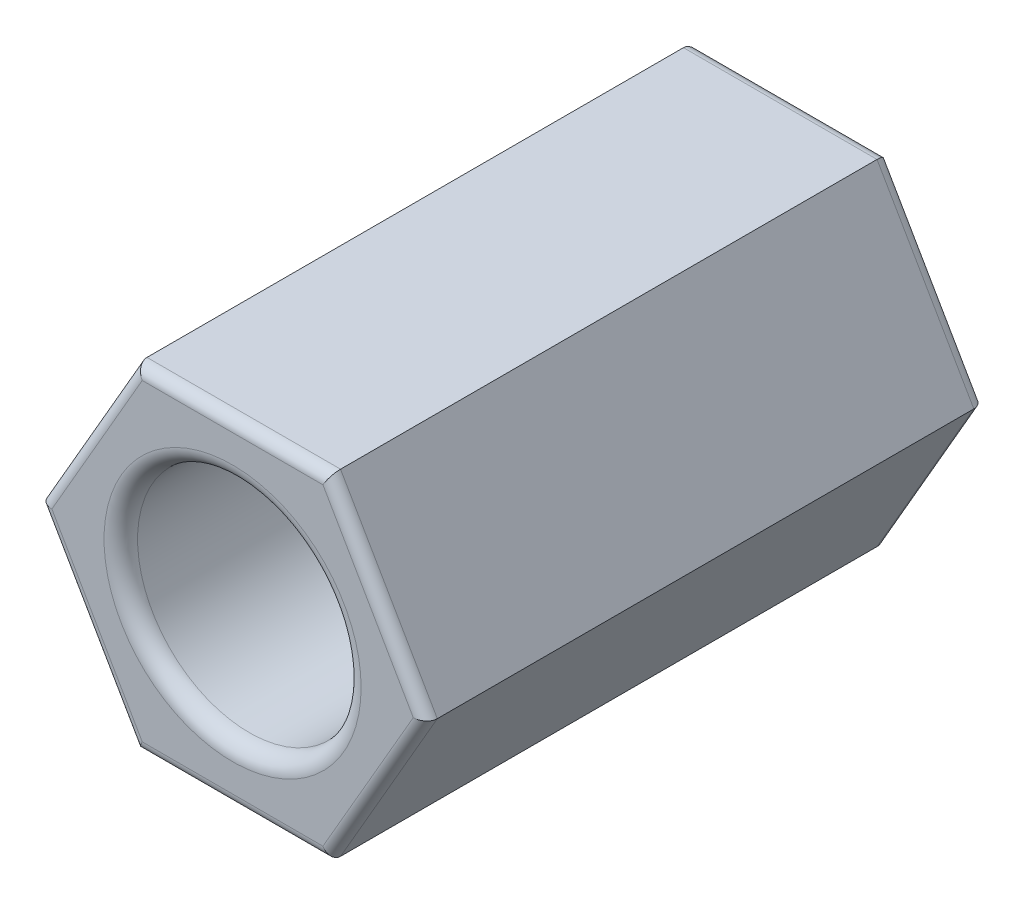
ISO-10303-21;
HEADER;
FILE_DESCRIPTION(('STEP AP214'),'2;1');
FILE_NAME('part.step','',(''),(''),'','','');
FILE_SCHEMA(('AUTOMOTIVE_DESIGN { 1 0 10303 214 1 1 1 1 }'));
ENDSEC;
DATA;
#1=APPLICATION_CONTEXT('core data for automotive mechanical design processes');
#2=APPLICATION_PROTOCOL_DEFINITION('international standard','automotive_design',2000,#1);
#3=PRODUCT_CONTEXT('',#1,'mechanical');
#4=PRODUCT('Part','Part','',(#3));
#5=PRODUCT_RELATED_PRODUCT_CATEGORY('part','',(#4));
#6=PRODUCT_DEFINITION_FORMATION('','',#4);
#7=PRODUCT_DEFINITION_CONTEXT('part definition',#1,'design');
#8=PRODUCT_DEFINITION('design','',#6,#7);
#9=PRODUCT_DEFINITION_SHAPE('','',#8);
#10=(LENGTH_UNIT() NAMED_UNIT(*) SI_UNIT(.MILLI.,.METRE.));
#11=(NAMED_UNIT(*) PLANE_ANGLE_UNIT() SI_UNIT($,.RADIAN.));
#12=(NAMED_UNIT(*) SI_UNIT($,.STERADIAN.) SOLID_ANGLE_UNIT());
#13=UNCERTAINTY_MEASURE_WITH_UNIT(LENGTH_MEASURE(1.E-05),#10,'distance_accuracy_value','');
#14=(GEOMETRIC_REPRESENTATION_CONTEXT(3) GLOBAL_UNCERTAINTY_ASSIGNED_CONTEXT((#13)) GLOBAL_UNIT_ASSIGNED_CONTEXT((#10,
#11,#12)) REPRESENTATION_CONTEXT('',''));
#15=CARTESIAN_POINT('',(0.,0.,0.));
#16=DIRECTION('',(0.,0.,1.));
#17=DIRECTION('',(1.,0.,0.));
#18=AXIS2_PLACEMENT_3D('',#15,#16,#17);
#19=CARTESIAN_POINT('',(0.,0.,10.));
#20=DIRECTION('',(0.,0.,1.));
#21=DIRECTION('',(1.,0.,0.));
#22=AXIS2_PLACEMENT_3D('',#19,#20,#21);
#23=PLANE('',#22);
#24=DIRECTION('',(-1.,0.,0.));
#25=VECTOR('',#24,1.);
#26=CARTESIAN_POINT('',(-1.73205080756888,2.8,10.));
#27=LINE('',#26,#25);
#28=CARTESIAN_POINT('',(1.61658075373095,2.8,10.));
#29=VERTEX_POINT('',#28);
#30=CARTESIAN_POINT('',(-1.61658075373095,2.8,10.));
#31=VERTEX_POINT('',#30);
#32=EDGE_CURVE('E129',#29,#31,#27,.T.);
#33=ORIENTED_EDGE('',*,*,#32,.T.);
#34=DIRECTION('',(-0.5,-0.866025403784439,0.));
#35=VECTOR('',#34,1.);
#36=CARTESIAN_POINT('',(-3.29089653438087,-0.1,10.));
#37=LINE('',#36,#35);
#38=CARTESIAN_POINT('',(-3.2331615074619,0.,10.));
#39=VERTEX_POINT('',#38);
#40=EDGE_CURVE('E162',#31,#39,#37,.T.);
#41=ORIENTED_EDGE('',*,*,#40,.T.);
#42=DIRECTION('',(0.5,-0.866025403784439,0.));
#43=VECTOR('',#42,1.);
#44=CARTESIAN_POINT('',(-1.55884572681199,-2.9,10.));
#45=LINE('',#44,#43);
#46=CARTESIAN_POINT('',(-1.61658075373095,-2.8,10.));
#47=VERTEX_POINT('',#46);
#48=EDGE_CURVE('E160',#39,#47,#45,.T.);
#49=ORIENTED_EDGE('',*,*,#48,.T.);
#50=DIRECTION('',(1.,0.,0.));
#51=VECTOR('',#50,1.);
#52=CARTESIAN_POINT('',(1.73205080756888,-2.8,10.));
#53=LINE('',#52,#51);
#54=CARTESIAN_POINT('',(1.61658075373095,-2.8,10.));
#55=VERTEX_POINT('',#54);
#56=EDGE_CURVE('E158',#47,#55,#53,.T.);
#57=ORIENTED_EDGE('',*,*,#56,.T.);
#58=DIRECTION('',(0.5,0.866025403784439,0.));
#59=VECTOR('',#58,1.);
#60=CARTESIAN_POINT('',(3.29089653438087,0.100000000000001,10.));
#61=LINE('',#60,#59);
#62=CARTESIAN_POINT('',(3.2331615074619,0.,10.));
#63=VERTEX_POINT('',#62);
#64=EDGE_CURVE('E132',#55,#63,#61,.T.);
#65=ORIENTED_EDGE('',*,*,#64,.T.);
#66=DIRECTION('',(-0.5,0.866025403784439,0.));
#67=VECTOR('',#66,1.);
#68=CARTESIAN_POINT('',(1.55884572681199,2.9,10.));
#69=LINE('',#68,#67);
#70=EDGE_CURVE('E124',#63,#29,#69,.T.);
#71=ORIENTED_EDGE('',*,*,#70,.T.);
#72=EDGE_LOOP('',(#33,#41,#49,#57,#65,#71));
#73=FACE_BOUND('',#72,.T.);
#74=CARTESIAN_POINT('',(0.,0.,10.));
#75=DIRECTION('',(0.,0.,1.));
#76=DIRECTION('',(1.,0.,0.));
#77=AXIS2_PLACEMENT_3D('',#74,#75,#76);
#78=CIRCLE('',#77,2.3);
#79=CARTESIAN_POINT('',(2.3,0.,10.));
#80=VERTEX_POINT('',#79);
#81=EDGE_CURVE('E150',#80,#80,#78,.F.);
#82=ORIENTED_EDGE('',*,*,#81,.T.);
#83=EDGE_LOOP('',(#82));
#84=FACE_BOUND('',#83,.T.);
#85=ADVANCED_FACE('F34',(#73,#84),#23,.T.);
#86=CARTESIAN_POINT('',(0.,0.,0.));
#87=DIRECTION('',(0.,0.,1.));
#88=DIRECTION('',(1.,0.,0.));
#89=AXIS2_PLACEMENT_3D('',#86,#87,#88);
#90=PLANE('',#89);
#91=DIRECTION('',(-0.5,0.866025403784439,0.));
#92=VECTOR('',#91,1.);
#93=CARTESIAN_POINT('',(2.42487113059643,1.4,0.));
#94=LINE('',#93,#92);
#95=CARTESIAN_POINT('',(1.61658075373095,2.8,0.));
#96=VERTEX_POINT('',#95);
#97=CARTESIAN_POINT('',(3.2331615074619,0.,0.));
#98=VERTEX_POINT('',#97);
#99=EDGE_CURVE('E189',#96,#98,#94,.F.);
#100=ORIENTED_EDGE('',*,*,#99,.T.);
#101=DIRECTION('',(0.5,0.866025403784439,0.));
#102=VECTOR('',#101,1.);
#103=CARTESIAN_POINT('',(2.42487113059643,-1.4,0.));
#104=LINE('',#103,#102);
#105=CARTESIAN_POINT('',(1.61658075373095,-2.8,0.));
#106=VERTEX_POINT('',#105);
#107=EDGE_CURVE('E11',#98,#106,#104,.F.);
#108=ORIENTED_EDGE('',*,*,#107,.T.);
#109=DIRECTION('',(1.,0.,0.));
#110=VECTOR('',#109,1.);
#111=CARTESIAN_POINT('',(0.,-2.8,0.));
#112=LINE('',#111,#110);
#113=CARTESIAN_POINT('',(-1.61658075373095,-2.8,0.));
#114=VERTEX_POINT('',#113);
#115=EDGE_CURVE('E43',#106,#114,#112,.F.);
#116=ORIENTED_EDGE('',*,*,#115,.T.);
#117=DIRECTION('',(0.5,-0.866025403784439,0.));
#118=VECTOR('',#117,1.);
#119=CARTESIAN_POINT('',(-2.42487113059643,-1.4,0.));
#120=LINE('',#119,#118);
#121=CARTESIAN_POINT('',(-3.2331615074619,0.,0.));
#122=VERTEX_POINT('',#121);
#123=EDGE_CURVE('E195',#114,#122,#120,.F.);
#124=ORIENTED_EDGE('',*,*,#123,.T.);
#125=DIRECTION('',(-0.5,-0.866025403784439,0.));
#126=VECTOR('',#125,1.);
#127=CARTESIAN_POINT('',(-2.42487113059643,1.4,0.));
#128=LINE('',#127,#126);
#129=CARTESIAN_POINT('',(-1.61658075373095,2.8,0.));
#130=VERTEX_POINT('',#129);
#131=EDGE_CURVE('E193',#122,#130,#128,.F.);
#132=ORIENTED_EDGE('',*,*,#131,.T.);
#133=DIRECTION('',(-1.,0.,0.));
#134=VECTOR('',#133,1.);
#135=CARTESIAN_POINT('',(0.,2.8,0.));
#136=LINE('',#135,#134);
#137=EDGE_CURVE('E191',#130,#96,#136,.F.);
#138=ORIENTED_EDGE('',*,*,#137,.T.);
#139=EDGE_LOOP('',(#100,#108,#116,#124,#132,#138));
#140=FACE_BOUND('',#139,.T.);
#141=CARTESIAN_POINT('',(0.,0.,0.));
#142=DIRECTION('',(0.,0.,1.));
#143=DIRECTION('',(1.,0.,0.));
#144=AXIS2_PLACEMENT_3D('',#141,#142,#143);
#145=CIRCLE('',#144,2.3);
#146=CARTESIAN_POINT('',(2.3,0.,0.));
#147=VERTEX_POINT('',#146);
#148=EDGE_CURVE('E253',#147,#147,#145,.T.);
#149=ORIENTED_EDGE('',*,*,#148,.T.);
#150=EDGE_LOOP('',(#149));
#151=FACE_BOUND('',#150,.T.);
#152=ADVANCED_FACE('F231',(#140,#151),#90,.F.);
#153=CARTESIAN_POINT('',(1.73205080756888,-3.,10.));
#154=DIRECTION('',(-0.866025403784439,0.5,0.));
#155=DIRECTION('',(-0.5,-0.866025403784439,0.));
#156=AXIS2_PLACEMENT_3D('',#153,#154,#155);
#157=PLANE('',#156);
#158=DIRECTION('',(0.,0.,-1.));
#159=VECTOR('',#158,1.);
#160=CARTESIAN_POINT('',(3.46410161513775,0.,10.));
#161=LINE('',#160,#159);
#162=CARTESIAN_POINT('',(3.46410161513775,0.,9.8));
#163=VERTEX_POINT('',#162);
#164=CARTESIAN_POINT('',(3.46410161513775,0.,0.200000000000001));
#165=VERTEX_POINT('',#164);
#166=EDGE_CURVE('E246',#163,#165,#161,.T.);
#167=ORIENTED_EDGE('',*,*,#166,.F.);
#168=DIRECTION('',(0.5,0.866025403784439,0.));
#169=VECTOR('',#168,1.);
#170=CARTESIAN_POINT('',(1.73205080756888,-3.,9.8));
#171=LINE('',#170,#169);
#172=CARTESIAN_POINT('',(1.73205080756888,-3.,9.8));
#173=VERTEX_POINT('',#172);
#174=EDGE_CURVE('E180',#163,#173,#171,.F.);
#175=ORIENTED_EDGE('',*,*,#174,.T.);
#176=DIRECTION('',(0.,0.,-1.));
#177=VECTOR('',#176,1.);
#178=CARTESIAN_POINT('',(1.73205080756888,-3.,10.));
#179=LINE('',#178,#177);
#180=CARTESIAN_POINT('',(1.73205080756888,-3.,0.200000000000001));
#181=VERTEX_POINT('',#180);
#182=EDGE_CURVE('E207',#173,#181,#179,.T.);
#183=ORIENTED_EDGE('',*,*,#182,.T.);
#184=DIRECTION('',(0.5,0.866025403784439,0.));
#185=VECTOR('',#184,1.);
#186=CARTESIAN_POINT('',(1.73205080756888,-3.,0.200000000000001));
#187=LINE('',#186,#185);
#188=EDGE_CURVE('E177',#181,#165,#187,.T.);
#189=ORIENTED_EDGE('',*,*,#188,.T.);
#190=EDGE_LOOP('',(#167,#175,#183,#189));
#191=FACE_BOUND('',#190,.T.);
#192=ADVANCED_FACE('F245',(#191),#157,.F.);
#193=CARTESIAN_POINT('',(3.46410161513775,0.,10.));
#194=DIRECTION('',(-0.866025403784438,-0.5,0.));
#195=DIRECTION('',(0.5,-0.866025403784439,0.));
#196=AXIS2_PLACEMENT_3D('',#193,#194,#195);
#197=PLANE('',#196);
#198=DIRECTION('',(0.,0.,-1.));
#199=VECTOR('',#198,1.);
#200=CARTESIAN_POINT('',(1.73205080756888,3.,10.));
#201=LINE('',#200,#199);
#202=CARTESIAN_POINT('',(1.73205080756888,3.,9.8));
#203=VERTEX_POINT('',#202);
#204=CARTESIAN_POINT('',(1.73205080756888,3.,0.200000000000001));
#205=VERTEX_POINT('',#204);
#206=EDGE_CURVE('E254',#203,#205,#201,.T.);
#207=ORIENTED_EDGE('',*,*,#206,.F.);
#208=DIRECTION('',(-0.5,0.866025403784439,0.));
#209=VECTOR('',#208,1.);
#210=CARTESIAN_POINT('',(3.46410161513776,0.,9.8));
#211=LINE('',#210,#209);
#212=EDGE_CURVE('E141',#203,#163,#211,.F.);
#213=ORIENTED_EDGE('',*,*,#212,.T.);
#214=ORIENTED_EDGE('',*,*,#166,.T.);
#215=DIRECTION('',(-0.5,0.866025403784439,0.));
#216=VECTOR('',#215,1.);
#217=CARTESIAN_POINT('',(3.46410161513775,0.,0.200000000000001));
#218=LINE('',#217,#216);
#219=EDGE_CURVE('E182',#165,#205,#218,.T.);
#220=ORIENTED_EDGE('',*,*,#219,.T.);
#221=EDGE_LOOP('',(#207,#213,#214,#220));
#222=FACE_BOUND('',#221,.T.);
#223=ADVANCED_FACE('F251',(#222),#197,.F.);
#224=CARTESIAN_POINT('',(1.73205080756888,3.,10.));
#225=DIRECTION('',(0.,-1.,0.));
#226=DIRECTION('',(0.,0.,-1.));
#227=AXIS2_PLACEMENT_3D('',#224,#225,#226);
#228=PLANE('',#227);
#229=DIRECTION('',(0.,0.,-1.));
#230=VECTOR('',#229,1.);
#231=CARTESIAN_POINT('',(-1.73205080756888,3.,10.));
#232=LINE('',#231,#230);
#233=CARTESIAN_POINT('',(-1.73205080756888,3.,9.8));
#234=VERTEX_POINT('',#233);
#235=CARTESIAN_POINT('',(-1.73205080756888,3.,0.200000000000001));
#236=VERTEX_POINT('',#235);
#237=EDGE_CURVE('E259',#234,#236,#232,.T.);
#238=ORIENTED_EDGE('',*,*,#237,.F.);
#239=DIRECTION('',(-1.,0.,0.));
#240=VECTOR('',#239,1.);
#241=CARTESIAN_POINT('',(1.73205080756888,3.,9.8));
#242=LINE('',#241,#240);
#243=EDGE_CURVE('E187',#234,#203,#242,.F.);
#244=ORIENTED_EDGE('',*,*,#243,.T.);
#245=ORIENTED_EDGE('',*,*,#206,.T.);
#246=DIRECTION('',(-1.,0.,0.));
#247=VECTOR('',#246,1.);
#248=CARTESIAN_POINT('',(1.73205080756888,3.,0.200000000000001));
#249=LINE('',#248,#247);
#250=EDGE_CURVE('E185',#205,#236,#249,.T.);
#251=ORIENTED_EDGE('',*,*,#250,.T.);
#252=EDGE_LOOP('',(#238,#244,#245,#251));
#253=FACE_BOUND('',#252,.T.);
#254=ADVANCED_FACE('F297',(#253),#228,.F.);
#255=CARTESIAN_POINT('',(-1.73205080756888,3.,10.));
#256=DIRECTION('',(0.866025403784439,-0.5,0.));
#257=DIRECTION('',(0.5,0.866025403784439,0.));
#258=AXIS2_PLACEMENT_3D('',#255,#256,#257);
#259=PLANE('',#258);
#260=DIRECTION('',(0.,0.,-1.));
#261=VECTOR('',#260,1.);
#262=CARTESIAN_POINT('',(-3.46410161513775,0.,10.));
#263=LINE('',#262,#261);
#264=CARTESIAN_POINT('',(-3.46410161513775,0.,9.8));
#265=VERTEX_POINT('',#264);
#266=CARTESIAN_POINT('',(-3.46410161513775,0.,0.200000000000001));
#267=VERTEX_POINT('',#266);
#268=EDGE_CURVE('E482',#265,#267,#263,.T.);
#269=ORIENTED_EDGE('',*,*,#268,.F.);
#270=DIRECTION('',(-0.5,-0.866025403784439,0.));
#271=VECTOR('',#270,1.);
#272=CARTESIAN_POINT('',(-1.73205080756888,3.,9.8));
#273=LINE('',#272,#271);
#274=EDGE_CURVE('E166',#265,#234,#273,.F.);
#275=ORIENTED_EDGE('',*,*,#274,.T.);
#276=ORIENTED_EDGE('',*,*,#237,.T.);
#277=DIRECTION('',(-0.5,-0.866025403784439,0.));
#278=VECTOR('',#277,1.);
#279=CARTESIAN_POINT('',(-1.73205080756888,3.,0.200000000000001));
#280=LINE('',#279,#278);
#281=EDGE_CURVE('E164',#236,#267,#280,.T.);
#282=ORIENTED_EDGE('',*,*,#281,.T.);
#283=EDGE_LOOP('',(#269,#275,#276,#282));
#284=FACE_BOUND('',#283,.T.);
#285=ADVANCED_FACE('F293',(#284),#259,.F.);
#286=CARTESIAN_POINT('',(-3.46410161513775,0.,10.));
#287=DIRECTION('',(0.866025403784439,0.5,0.));
#288=DIRECTION('',(-0.5,0.866025403784439,0.));
#289=AXIS2_PLACEMENT_3D('',#286,#287,#288);
#290=PLANE('',#289);
#291=DIRECTION('',(0.,0.,-1.));
#292=VECTOR('',#291,1.);
#293=CARTESIAN_POINT('',(-1.73205080756888,-3.,10.));
#294=LINE('',#293,#292);
#295=CARTESIAN_POINT('',(-1.73205080756888,-3.,9.8));
#296=VERTEX_POINT('',#295);
#297=CARTESIAN_POINT('',(-1.73205080756888,-3.,0.200000000000001));
#298=VERTEX_POINT('',#297);
#299=EDGE_CURVE('E479',#296,#298,#294,.T.);
#300=ORIENTED_EDGE('',*,*,#299,.F.);
#301=DIRECTION('',(0.5,-0.866025403784439,0.));
#302=VECTOR('',#301,1.);
#303=CARTESIAN_POINT('',(-3.46410161513775,0.,9.8));
#304=LINE('',#303,#302);
#305=EDGE_CURVE('E171',#296,#265,#304,.F.);
#306=ORIENTED_EDGE('',*,*,#305,.T.);
#307=ORIENTED_EDGE('',*,*,#268,.T.);
#308=DIRECTION('',(0.5,-0.866025403784439,0.));
#309=VECTOR('',#308,1.);
#310=CARTESIAN_POINT('',(-3.46410161513775,0.,0.200000000000001));
#311=LINE('',#310,#309);
#312=EDGE_CURVE('E169',#267,#298,#311,.T.);
#313=ORIENTED_EDGE('',*,*,#312,.T.);
#314=EDGE_LOOP('',(#300,#306,#307,#313));
#315=FACE_BOUND('',#314,.T.);
#316=ADVANCED_FACE('F289',(#315),#290,.F.);
#317=CARTESIAN_POINT('',(-1.73205080756888,-3.,10.));
#318=DIRECTION('',(0.,1.,0.));
#319=DIRECTION('',(-1.,0.,0.));
#320=AXIS2_PLACEMENT_3D('',#317,#318,#319);
#321=PLANE('',#320);
#322=ORIENTED_EDGE('',*,*,#182,.F.);
#323=DIRECTION('',(1.,0.,0.));
#324=VECTOR('',#323,1.);
#325=CARTESIAN_POINT('',(-1.73205080756888,-3.,9.8));
#326=LINE('',#325,#324);
#327=EDGE_CURVE('E175',#173,#296,#326,.F.);
#328=ORIENTED_EDGE('',*,*,#327,.T.);
#329=ORIENTED_EDGE('',*,*,#299,.T.);
#330=DIRECTION('',(1.,0.,0.));
#331=VECTOR('',#330,1.);
#332=CARTESIAN_POINT('',(-1.73205080756888,-3.,0.200000000000001));
#333=LINE('',#332,#331);
#334=EDGE_CURVE('E173',#298,#181,#333,.T.);
#335=ORIENTED_EDGE('',*,*,#334,.T.);
#336=EDGE_LOOP('',(#322,#328,#329,#335));
#337=FACE_BOUND('',#336,.T.);
#338=ADVANCED_FACE('F286',(#337),#321,.F.);
#339=CARTESIAN_POINT('',(0.,0.,10.));
#340=DIRECTION('',(0.,0.,-1.));
#341=DIRECTION('',(-1.,0.,0.));
#342=AXIS2_PLACEMENT_3D('',#339,#340,#341);
#343=CYLINDRICAL_SURFACE('',#342,2.);
#344=CARTESIAN_POINT('',(0.,0.,0.3));
#345=DIRECTION('',(0.,0.,1.));
#346=DIRECTION('',(1.,0.,0.));
#347=AXIS2_PLACEMENT_3D('',#344,#345,#346);
#348=CIRCLE('',#347,2.);
#349=CARTESIAN_POINT('',(2.,0.,0.3));
#350=VERTEX_POINT('',#349);
#351=EDGE_CURVE('E153',#350,#350,#348,.F.);
#352=ORIENTED_EDGE('',*,*,#351,.T.);
#353=EDGE_LOOP('',(#352));
#354=FACE_BOUND('',#353,.T.);
#355=CARTESIAN_POINT('',(0.,0.,9.7));
#356=DIRECTION('',(0.,0.,1.));
#357=DIRECTION('',(1.,0.,0.));
#358=AXIS2_PLACEMENT_3D('',#355,#356,#357);
#359=CIRCLE('',#358,2.);
#360=CARTESIAN_POINT('',(2.,0.,9.7));
#361=VERTEX_POINT('',#360);
#362=EDGE_CURVE('E257',#361,#361,#359,.T.);
#363=ORIENTED_EDGE('',*,*,#362,.T.);
#364=EDGE_LOOP('',(#363));
#365=FACE_BOUND('',#364,.T.);
#366=ADVANCED_FACE('F267',(#354,#365),#343,.F.);
#367=CARTESIAN_POINT('',(0.,0.,0.3));
#368=DIRECTION('',(0.,0.,1.));
#369=DIRECTION('',(1.,0.,0.));
#370=AXIS2_PLACEMENT_3D('',#367,#368,#369);
#371=TOROIDAL_SURFACE('',#370,2.3,0.3);
#372=ORIENTED_EDGE('',*,*,#351,.F.);
#373=EDGE_LOOP('',(#372));
#374=FACE_BOUND('',#373,.T.);
#375=ORIENTED_EDGE('',*,*,#148,.F.);
#376=EDGE_LOOP('',(#375));
#377=FACE_BOUND('',#376,.T.);
#378=ADVANCED_FACE('F270',(#374,#377),#371,.T.);
#379=CARTESIAN_POINT('',(0.,0.,9.7));
#380=DIRECTION('',(0.,0.,1.));
#381=DIRECTION('',(1.,0.,0.));
#382=AXIS2_PLACEMENT_3D('',#379,#380,#381);
#383=TOROIDAL_SURFACE('',#382,2.3,0.3);
#384=ORIENTED_EDGE('',*,*,#81,.F.);
#385=EDGE_LOOP('',(#384));
#386=FACE_BOUND('',#385,.T.);
#387=ORIENTED_EDGE('',*,*,#362,.F.);
#388=EDGE_LOOP('',(#387));
#389=FACE_BOUND('',#388,.T.);
#390=ADVANCED_FACE('F273',(#386,#389),#383,.T.);
#391=CARTESIAN_POINT('',(2.42487113059643,-1.4,9.8));
#392=DIRECTION('',(-0.5,-0.866025403784439,0.));
#393=DIRECTION('',(0.866025403784439,-0.5,0.));
#394=AXIS2_PLACEMENT_3D('',#391,#392,#393);
#395=CYLINDRICAL_SURFACE('',#394,0.2);
#396=CARTESIAN_POINT('',(1.61658075373095,-2.8,9.8));
#397=DIRECTION('',(-0.866025403784438,-0.5,0.));
#398=DIRECTION('',(0.5,-0.866025403784438,0.));
#399=AXIS2_PLACEMENT_3D('',#396,#397,#398);
#400=ELLIPSE('',#399,0.23094010767585,0.2);
#401=EDGE_CURVE('E144',#173,#55,#400,.T.);
#402=ORIENTED_EDGE('',*,*,#401,.F.);
#403=ORIENTED_EDGE('',*,*,#174,.F.);
#404=CARTESIAN_POINT('',(3.2331615074619,0.,9.8));
#405=DIRECTION('',(0.,-1.,0.));
#406=DIRECTION('',(1.,0.,0.));
#407=AXIS2_PLACEMENT_3D('',#404,#405,#406);
#408=ELLIPSE('',#407,0.23094010767585,0.2);
#409=EDGE_CURVE('E205',#63,#163,#408,.F.);
#410=ORIENTED_EDGE('',*,*,#409,.F.);
#411=ORIENTED_EDGE('',*,*,#64,.F.);
#412=EDGE_LOOP('',(#402,#403,#410,#411));
#413=FACE_BOUND('',#412,.T.);
#414=ADVANCED_FACE('F306',(#413),#395,.T.);
#415=CARTESIAN_POINT('',(2.42487113059643,1.4,9.8));
#416=DIRECTION('',(0.5,-0.866025403784439,0.));
#417=DIRECTION('',(0.866025403784438,0.5,0.));
#418=AXIS2_PLACEMENT_3D('',#415,#416,#417);
#419=CYLINDRICAL_SURFACE('',#418,0.2);
#420=ORIENTED_EDGE('',*,*,#409,.T.);
#421=ORIENTED_EDGE('',*,*,#212,.F.);
#422=CARTESIAN_POINT('',(1.61658075373095,2.8,9.8));
#423=DIRECTION('',(0.866025403784439,-0.5,0.));
#424=DIRECTION('',(0.5,0.866025403784439,0.));
#425=AXIS2_PLACEMENT_3D('',#422,#423,#424);
#426=ELLIPSE('',#425,0.23094010767585,0.2);
#427=EDGE_CURVE('E139',#29,#203,#426,.F.);
#428=ORIENTED_EDGE('',*,*,#427,.F.);
#429=ORIENTED_EDGE('',*,*,#70,.F.);
#430=EDGE_LOOP('',(#420,#421,#428,#429));
#431=FACE_BOUND('',#430,.T.);
#432=ADVANCED_FACE('F140',(#431),#419,.T.);
#433=CARTESIAN_POINT('',(0.,-2.8,9.8));
#434=DIRECTION('',(-1.,0.,0.));
#435=DIRECTION('',(0.,-1.,0.));
#436=AXIS2_PLACEMENT_3D('',#433,#434,#435);
#437=CYLINDRICAL_SURFACE('',#436,0.2);
#438=ORIENTED_EDGE('',*,*,#401,.T.);
#439=ORIENTED_EDGE('',*,*,#56,.F.);
#440=CARTESIAN_POINT('',(-1.61658075373095,-2.8,9.8));
#441=DIRECTION('',(-0.866025403784439,0.5,0.));
#442=DIRECTION('',(-0.5,-0.866025403784439,0.));
#443=AXIS2_PLACEMENT_3D('',#440,#441,#442);
#444=ELLIPSE('',#443,0.23094010767585,0.2);
#445=EDGE_CURVE('E145',#296,#47,#444,.T.);
#446=ORIENTED_EDGE('',*,*,#445,.F.);
#447=ORIENTED_EDGE('',*,*,#327,.F.);
#448=EDGE_LOOP('',(#438,#439,#446,#447));
#449=FACE_BOUND('',#448,.T.);
#450=ADVANCED_FACE('F318',(#449),#437,.T.);
#451=CARTESIAN_POINT('',(0.,2.8,9.8));
#452=DIRECTION('',(1.,0.,0.));
#453=DIRECTION('',(0.,0.,-1.));
#454=AXIS2_PLACEMENT_3D('',#451,#452,#453);
#455=CYLINDRICAL_SURFACE('',#454,0.2);
#456=ORIENTED_EDGE('',*,*,#427,.T.);
#457=ORIENTED_EDGE('',*,*,#243,.F.);
#458=CARTESIAN_POINT('',(-1.61658075373095,2.8,9.8));
#459=DIRECTION('',(0.866025403784439,0.5,0.));
#460=DIRECTION('',(0.5,-0.866025403784439,0.));
#461=AXIS2_PLACEMENT_3D('',#458,#459,#460);
#462=ELLIPSE('',#461,0.23094010767585,0.2);
#463=EDGE_CURVE('E148',#31,#234,#462,.F.);
#464=ORIENTED_EDGE('',*,*,#463,.F.);
#465=ORIENTED_EDGE('',*,*,#32,.F.);
#466=EDGE_LOOP('',(#456,#457,#464,#465));
#467=FACE_BOUND('',#466,.T.);
#468=ADVANCED_FACE('F147',(#467),#455,.T.);
#469=CARTESIAN_POINT('',(-2.42487113059643,-1.4,9.8));
#470=DIRECTION('',(-0.5,0.866025403784439,0.));
#471=DIRECTION('',(-0.866025403784439,-0.5,0.));
#472=AXIS2_PLACEMENT_3D('',#469,#470,#471);
#473=CYLINDRICAL_SURFACE('',#472,0.2);
#474=ORIENTED_EDGE('',*,*,#445,.T.);
#475=ORIENTED_EDGE('',*,*,#48,.F.);
#476=CARTESIAN_POINT('',(-3.2331615074619,0.,9.8));
#477=DIRECTION('',(0.,1.,0.));
#478=DIRECTION('',(-1.,0.,0.));
#479=AXIS2_PLACEMENT_3D('',#476,#477,#478);
#480=ELLIPSE('',#479,0.23094010767585,0.2);
#481=EDGE_CURVE('E198',#265,#39,#480,.T.);
#482=ORIENTED_EDGE('',*,*,#481,.F.);
#483=ORIENTED_EDGE('',*,*,#305,.F.);
#484=EDGE_LOOP('',(#474,#475,#482,#483));
#485=FACE_BOUND('',#484,.T.);
#486=ADVANCED_FACE('F311',(#485),#473,.T.);
#487=CARTESIAN_POINT('',(-2.42487113059643,1.4,9.8));
#488=DIRECTION('',(0.5,0.866025403784439,0.));
#489=DIRECTION('',(-0.866025403784439,0.5,0.));
#490=AXIS2_PLACEMENT_3D('',#487,#488,#489);
#491=CYLINDRICAL_SURFACE('',#490,0.2);
#492=ORIENTED_EDGE('',*,*,#463,.T.);
#493=ORIENTED_EDGE('',*,*,#274,.F.);
#494=ORIENTED_EDGE('',*,*,#481,.T.);
#495=ORIENTED_EDGE('',*,*,#40,.F.);
#496=EDGE_LOOP('',(#492,#493,#494,#495));
#497=FACE_BOUND('',#496,.T.);
#498=ADVANCED_FACE('F308',(#497),#491,.T.);
#499=CARTESIAN_POINT('',(-1.55884572681199,2.9,0.200000000000001));
#500=DIRECTION('',(-0.5,-0.866025403784439,0.));
#501=DIRECTION('',(0.866025403784439,-0.5,0.));
#502=AXIS2_PLACEMENT_3D('',#499,#500,#501);
#503=CYLINDRICAL_SURFACE('',#502,0.2);
#504=CARTESIAN_POINT('',(-1.61658075373095,2.8,0.200000000000001));
#505=DIRECTION('',(-0.866025403784439,-0.5,0.));
#506=DIRECTION('',(-0.5,0.866025403784439,0.));
#507=AXIS2_PLACEMENT_3D('',#504,#505,#506);
#508=ELLIPSE('',#507,0.23094010767585,0.2);
#509=EDGE_CURVE('E216',#130,#236,#508,.F.);
#510=ORIENTED_EDGE('',*,*,#509,.F.);
#511=ORIENTED_EDGE('',*,*,#131,.F.);
#512=CARTESIAN_POINT('',(-3.2331615074619,0.,0.200000000000001));
#513=DIRECTION('',(0.,-1.,0.));
#514=DIRECTION('',(-1.,0.,0.));
#515=AXIS2_PLACEMENT_3D('',#512,#513,#514);
#516=ELLIPSE('',#515,0.23094010767585,0.2);
#517=EDGE_CURVE('E38',#267,#122,#516,.T.);
#518=ORIENTED_EDGE('',*,*,#517,.F.);
#519=ORIENTED_EDGE('',*,*,#281,.F.);
#520=EDGE_LOOP('',(#510,#511,#518,#519));
#521=FACE_BOUND('',#520,.T.);
#522=ADVANCED_FACE('F36',(#521),#503,.T.);
#523=CARTESIAN_POINT('',(-3.29089653438087,0.0999999999999996,0.200000000000001));
#524=DIRECTION('',(0.5,-0.866025403784439,0.));
#525=DIRECTION('',(0.866025403784439,0.5,0.));
#526=AXIS2_PLACEMENT_3D('',#523,#524,#525);
#527=CYLINDRICAL_SURFACE('',#526,0.2);
#528=ORIENTED_EDGE('',*,*,#517,.T.);
#529=ORIENTED_EDGE('',*,*,#123,.F.);
#530=CARTESIAN_POINT('',(-1.61658075373095,-2.8,0.200000000000001));
#531=DIRECTION('',(0.866025403784439,-0.5,0.));
#532=DIRECTION('',(-0.5,-0.866025403784439,0.));
#533=AXIS2_PLACEMENT_3D('',#530,#531,#532);
#534=ELLIPSE('',#533,0.23094010767585,0.2);
#535=EDGE_CURVE('E214',#298,#114,#534,.T.);
#536=ORIENTED_EDGE('',*,*,#535,.F.);
#537=ORIENTED_EDGE('',*,*,#312,.F.);
#538=EDGE_LOOP('',(#528,#529,#536,#537));
#539=FACE_BOUND('',#538,.T.);
#540=ADVANCED_FACE('F226',(#539),#527,.T.);
#541=CARTESIAN_POINT('',(1.73205080756888,2.8,0.200000000000001));
#542=DIRECTION('',(-1.,0.,0.));
#543=DIRECTION('',(0.,0.,1.));
#544=AXIS2_PLACEMENT_3D('',#541,#542,#543);
#545=CYLINDRICAL_SURFACE('',#544,0.2);
#546=ORIENTED_EDGE('',*,*,#509,.T.);
#547=ORIENTED_EDGE('',*,*,#250,.F.);
#548=CARTESIAN_POINT('',(1.61658075373095,2.8,0.200000000000001));
#549=DIRECTION('',(-0.866025403784439,0.5,0.));
#550=DIRECTION('',(0.5,0.866025403784439,0.));
#551=AXIS2_PLACEMENT_3D('',#548,#549,#550);
#552=ELLIPSE('',#551,0.23094010767585,0.2);
#553=EDGE_CURVE('E211',#96,#205,#552,.F.);
#554=ORIENTED_EDGE('',*,*,#553,.F.);
#555=ORIENTED_EDGE('',*,*,#137,.F.);
#556=EDGE_LOOP('',(#546,#547,#554,#555));
#557=FACE_BOUND('',#556,.T.);
#558=ADVANCED_FACE('F235',(#557),#545,.T.);
#559=CARTESIAN_POINT('',(-1.73205080756888,-2.8,0.200000000000001));
#560=DIRECTION('',(1.,0.,0.));
#561=DIRECTION('',(0.,1.,0.));
#562=AXIS2_PLACEMENT_3D('',#559,#560,#561);
#563=CYLINDRICAL_SURFACE('',#562,0.2);
#564=ORIENTED_EDGE('',*,*,#535,.T.);
#565=ORIENTED_EDGE('',*,*,#115,.F.);
#566=CARTESIAN_POINT('',(1.61658075373095,-2.8,0.200000000000001));
#567=DIRECTION('',(0.866025403784438,0.5,0.));
#568=DIRECTION('',(0.5,-0.866025403784438,0.));
#569=AXIS2_PLACEMENT_3D('',#566,#567,#568);
#570=ELLIPSE('',#569,0.23094010767585,0.2);
#571=EDGE_CURVE('E51',#181,#106,#570,.T.);
#572=ORIENTED_EDGE('',*,*,#571,.F.);
#573=ORIENTED_EDGE('',*,*,#334,.F.);
#574=EDGE_LOOP('',(#564,#565,#572,#573));
#575=FACE_BOUND('',#574,.T.);
#576=ADVANCED_FACE('F331',(#575),#563,.T.);
#577=CARTESIAN_POINT('',(3.29089653438087,-0.0999999999999992,0.200000000000001));
#578=DIRECTION('',(-0.5,0.866025403784439,0.));
#579=DIRECTION('',(-0.866025403784438,-0.5,0.));
#580=AXIS2_PLACEMENT_3D('',#577,#578,#579);
#581=CYLINDRICAL_SURFACE('',#580,0.2);
#582=ORIENTED_EDGE('',*,*,#553,.T.);
#583=ORIENTED_EDGE('',*,*,#219,.F.);
#584=CARTESIAN_POINT('',(3.2331615074619,0.,0.200000000000001));
#585=DIRECTION('',(0.,1.,0.));
#586=DIRECTION('',(-1.,0.,0.));
#587=AXIS2_PLACEMENT_3D('',#584,#585,#586);
#588=ELLIPSE('',#587,0.23094010767585,0.2);
#589=EDGE_CURVE('E208',#98,#165,#588,.F.);
#590=ORIENTED_EDGE('',*,*,#589,.F.);
#591=ORIENTED_EDGE('',*,*,#99,.F.);
#592=EDGE_LOOP('',(#582,#583,#590,#591));
#593=FACE_BOUND('',#592,.T.);
#594=ADVANCED_FACE('F239',(#593),#581,.T.);
#595=CARTESIAN_POINT('',(1.55884572681199,-2.9,0.200000000000001));
#596=DIRECTION('',(0.5,0.866025403784439,0.));
#597=DIRECTION('',(-0.866025403784439,0.5,0.));
#598=AXIS2_PLACEMENT_3D('',#595,#596,#597);
#599=CYLINDRICAL_SURFACE('',#598,0.2);
#600=ORIENTED_EDGE('',*,*,#571,.T.);
#601=ORIENTED_EDGE('',*,*,#107,.F.);
#602=ORIENTED_EDGE('',*,*,#589,.T.);
#603=ORIENTED_EDGE('',*,*,#188,.F.);
#604=EDGE_LOOP('',(#600,#601,#602,#603));
#605=FACE_BOUND('',#604,.T.);
#606=ADVANCED_FACE('F240',(#605),#599,.T.);
#607=CLOSED_SHELL('',(#85,#152,#192,#223,#254,#285,#316,#338,#366,#378,#390,#414,#432,#450,#468,
#486,#498,#522,#540,#558,#576,#594,#606));
#608=MANIFOLD_SOLID_BREP('B2',#607);
#609=ADVANCED_BREP_SHAPE_REPRESENTATION('',(#18,#608),#14);
#610=SHAPE_DEFINITION_REPRESENTATION(#9,#609);
ENDSEC;
END-ISO-10303-21;
